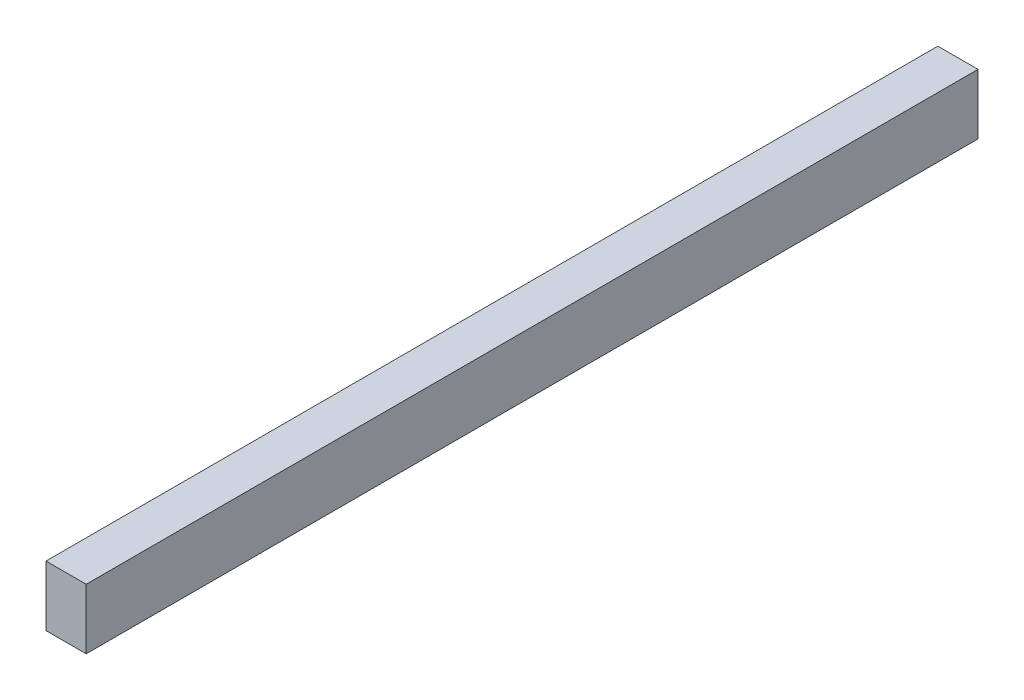
ISO-10303-21;
HEADER;
FILE_DESCRIPTION(('STEP AP214'),'2;1');
FILE_NAME('part.step','',(''),(''),'','','');
FILE_SCHEMA(('AUTOMOTIVE_DESIGN { 1 0 10303 214 1 1 1 1 }'));
ENDSEC;
DATA;
#1=APPLICATION_CONTEXT('core data for automotive mechanical design processes');
#2=APPLICATION_PROTOCOL_DEFINITION('international standard','automotive_design',2000,#1);
#3=PRODUCT_CONTEXT('',#1,'mechanical');
#4=PRODUCT('Part','Part','',(#3));
#5=PRODUCT_RELATED_PRODUCT_CATEGORY('part','',(#4));
#6=PRODUCT_DEFINITION_FORMATION('','',#4);
#7=PRODUCT_DEFINITION_CONTEXT('part definition',#1,'design');
#8=PRODUCT_DEFINITION('design','',#6,#7);
#9=PRODUCT_DEFINITION_SHAPE('','',#8);
#10=(LENGTH_UNIT() NAMED_UNIT(*) SI_UNIT(.MILLI.,.METRE.));
#11=(NAMED_UNIT(*) PLANE_ANGLE_UNIT() SI_UNIT($,.RADIAN.));
#12=(NAMED_UNIT(*) SI_UNIT($,.STERADIAN.) SOLID_ANGLE_UNIT());
#13=UNCERTAINTY_MEASURE_WITH_UNIT(LENGTH_MEASURE(1.E-05),#10,'distance_accuracy_value','');
#14=(GEOMETRIC_REPRESENTATION_CONTEXT(3) GLOBAL_UNCERTAINTY_ASSIGNED_CONTEXT((#13)) GLOBAL_UNIT_ASSIGNED_CONTEXT((#10,
#11,#12)) REPRESENTATION_CONTEXT('',''));
#15=CARTESIAN_POINT('',(0.,0.,0.));
#16=DIRECTION('',(0.,0.,1.));
#17=DIRECTION('',(1.,0.,0.));
#18=AXIS2_PLACEMENT_3D('',#15,#16,#17);
#19=CARTESIAN_POINT('',(0.,0.,2220.));
#20=DIRECTION('',(1.,0.,0.));
#21=DIRECTION('',(0.,0.,-1.));
#22=AXIS2_PLACEMENT_3D('',#19,#20,#21);
#23=PLANE('',#22);
#24=DIRECTION('',(0.,1.,0.));
#25=VECTOR('',#24,1.);
#26=CARTESIAN_POINT('',(0.,0.,2120.));
#27=LINE('',#26,#25);
#28=CARTESIAN_POINT('',(0.,0.,2120.));
#29=VERTEX_POINT('',#28);
#30=CARTESIAN_POINT('',(0.,150.,2120.));
#31=VERTEX_POINT('',#30);
#32=EDGE_CURVE('E12',#29,#31,#27,.T.);
#33=ORIENTED_EDGE('',*,*,#32,.F.);
#34=DIRECTION('',(0.,0.,-1.));
#35=VECTOR('',#34,1.);
#36=CARTESIAN_POINT('',(0.,0.,2220.));
#37=LINE('',#36,#35);
#38=CARTESIAN_POINT('',(0.,0.,2220.));
#39=VERTEX_POINT('',#38);
#40=EDGE_CURVE('E105',#39,#29,#37,.T.);
#41=ORIENTED_EDGE('',*,*,#40,.F.);
#42=DIRECTION('',(0.,-1.,0.));
#43=VECTOR('',#42,1.);
#44=CARTESIAN_POINT('',(0.,0.,2220.));
#45=LINE('',#44,#43);
#46=CARTESIAN_POINT('',(0.,150.,2220.));
#47=VERTEX_POINT('',#46);
#48=EDGE_CURVE('E112',#47,#39,#45,.T.);
#49=ORIENTED_EDGE('',*,*,#48,.F.);
#50=DIRECTION('',(0.,0.,-1.));
#51=VECTOR('',#50,1.);
#52=CARTESIAN_POINT('',(0.,150.,2220.));
#53=LINE('',#52,#51);
#54=EDGE_CURVE('E139',#47,#31,#53,.T.);
#55=ORIENTED_EDGE('',*,*,#54,.T.);
#56=EDGE_LOOP('',(#33,#41,#49,#55));
#57=FACE_BOUND('',#56,.T.);
#58=ADVANCED_FACE('F51',(#57),#23,.F.);
#59=CARTESIAN_POINT('',(0.,0.,100.));
#60=VERTEX_POINT('',#59);
#61=EDGE_CURVE('E123',#29,#60,#37,.T.);
#62=ORIENTED_EDGE('',*,*,#61,.F.);
#63=ORIENTED_EDGE('',*,*,#32,.T.);
#64=CARTESIAN_POINT('',(0.,150.,100.));
#65=VERTEX_POINT('',#64);
#66=EDGE_CURVE('E145',#31,#65,#53,.T.);
#67=ORIENTED_EDGE('',*,*,#66,.T.);
#68=DIRECTION('',(0.,1.,0.));
#69=VECTOR('',#68,1.);
#70=CARTESIAN_POINT('',(0.,0.,100.));
#71=LINE('',#70,#69);
#72=EDGE_CURVE('E60',#60,#65,#71,.T.);
#73=ORIENTED_EDGE('',*,*,#72,.F.);
#74=EDGE_LOOP('',(#62,#63,#67,#73));
#75=FACE_BOUND('',#74,.T.);
#76=ADVANCED_FACE('F191',(#75),#23,.F.);
#77=CARTESIAN_POINT('',(0.,0.,0.));
#78=VERTEX_POINT('',#77);
#79=EDGE_CURVE('E124',#60,#78,#37,.T.);
#80=ORIENTED_EDGE('',*,*,#79,.F.);
#81=ORIENTED_EDGE('',*,*,#72,.T.);
#82=CARTESIAN_POINT('',(0.,150.,0.));
#83=VERTEX_POINT('',#82);
#84=EDGE_CURVE('E146',#65,#83,#53,.T.);
#85=ORIENTED_EDGE('',*,*,#84,.T.);
#86=DIRECTION('',(0.,-1.,0.));
#87=VECTOR('',#86,1.);
#88=CARTESIAN_POINT('',(0.,0.,0.));
#89=LINE('',#88,#87);
#90=EDGE_CURVE('E163',#83,#78,#89,.T.);
#91=ORIENTED_EDGE('',*,*,#90,.T.);
#92=EDGE_LOOP('',(#80,#81,#85,#91));
#93=FACE_BOUND('',#92,.T.);
#94=ADVANCED_FACE('F53',(#93),#23,.F.);
#95=CARTESIAN_POINT('',(0.,0.,2220.));
#96=DIRECTION('',(0.,1.,0.));
#97=DIRECTION('',(0.,0.,1.));
#98=AXIS2_PLACEMENT_3D('',#95,#96,#97);
#99=PLANE('',#98);
#100=DIRECTION('',(1.,0.,0.));
#101=VECTOR('',#100,1.);
#102=CARTESIAN_POINT('',(0.,0.,0.));
#103=LINE('',#102,#101);
#104=CARTESIAN_POINT('',(100.,0.,0.));
#105=VERTEX_POINT('',#104);
#106=EDGE_CURVE('E160',#78,#105,#103,.T.);
#107=ORIENTED_EDGE('',*,*,#106,.T.);
#108=DIRECTION('',(0.,0.,-1.));
#109=VECTOR('',#108,1.);
#110=CARTESIAN_POINT('',(100.,0.,2220.));
#111=LINE('',#110,#109);
#112=CARTESIAN_POINT('',(100.,0.,2220.));
#113=VERTEX_POINT('',#112);
#114=EDGE_CURVE('E107',#113,#105,#111,.T.);
#115=ORIENTED_EDGE('',*,*,#114,.F.);
#116=DIRECTION('',(1.,0.,0.));
#117=VECTOR('',#116,1.);
#118=CARTESIAN_POINT('',(0.,0.,2220.));
#119=LINE('',#118,#117);
#120=EDGE_CURVE('E102',#39,#113,#119,.T.);
#121=ORIENTED_EDGE('',*,*,#120,.F.);
#122=ORIENTED_EDGE('',*,*,#40,.T.);
#123=ORIENTED_EDGE('',*,*,#61,.T.);
#124=ORIENTED_EDGE('',*,*,#79,.T.);
#125=EDGE_LOOP('',(#107,#115,#121,#122,#123,#124));
#126=FACE_BOUND('',#125,.T.);
#127=ADVANCED_FACE('F104',(#126),#99,.F.);
#128=CARTESIAN_POINT('',(100.,0.,2220.));
#129=DIRECTION('',(-1.,0.,0.));
#130=DIRECTION('',(0.,0.,1.));
#131=AXIS2_PLACEMENT_3D('',#128,#129,#130);
#132=PLANE('',#131);
#133=DIRECTION('',(0.,1.,0.));
#134=VECTOR('',#133,1.);
#135=CARTESIAN_POINT('',(100.,0.,0.));
#136=LINE('',#135,#134);
#137=CARTESIAN_POINT('',(100.,150.,0.));
#138=VERTEX_POINT('',#137);
#139=EDGE_CURVE('E157',#105,#138,#136,.T.);
#140=ORIENTED_EDGE('',*,*,#139,.T.);
#141=DIRECTION('',(0.,0.,-1.));
#142=VECTOR('',#141,1.);
#143=CARTESIAN_POINT('',(100.,150.,2220.));
#144=LINE('',#143,#142);
#145=CARTESIAN_POINT('',(100.,150.,2220.));
#146=VERTEX_POINT('',#145);
#147=EDGE_CURVE('E134',#146,#138,#144,.T.);
#148=ORIENTED_EDGE('',*,*,#147,.F.);
#149=DIRECTION('',(0.,1.,0.));
#150=VECTOR('',#149,1.);
#151=CARTESIAN_POINT('',(100.,0.,2220.));
#152=LINE('',#151,#150);
#153=EDGE_CURVE('E111',#113,#146,#152,.T.);
#154=ORIENTED_EDGE('',*,*,#153,.F.);
#155=ORIENTED_EDGE('',*,*,#114,.T.);
#156=EDGE_LOOP('',(#140,#148,#154,#155));
#157=FACE_BOUND('',#156,.T.);
#158=ADVANCED_FACE('F171',(#157),#132,.F.);
#159=CARTESIAN_POINT('',(0.,150.,2220.));
#160=DIRECTION('',(0.,-1.,0.));
#161=DIRECTION('',(0.,0.,-1.));
#162=AXIS2_PLACEMENT_3D('',#159,#160,#161);
#163=PLANE('',#162);
#164=DIRECTION('',(-1.,0.,0.));
#165=VECTOR('',#164,1.);
#166=CARTESIAN_POINT('',(0.,150.,0.));
#167=LINE('',#166,#165);
#168=EDGE_CURVE('E120',#138,#83,#167,.T.);
#169=ORIENTED_EDGE('',*,*,#168,.T.);
#170=ORIENTED_EDGE('',*,*,#84,.F.);
#171=ORIENTED_EDGE('',*,*,#66,.F.);
#172=ORIENTED_EDGE('',*,*,#54,.F.);
#173=DIRECTION('',(-1.,0.,0.));
#174=VECTOR('',#173,1.);
#175=CARTESIAN_POINT('',(0.,150.,2220.));
#176=LINE('',#175,#174);
#177=EDGE_CURVE('E117',#146,#47,#176,.T.);
#178=ORIENTED_EDGE('',*,*,#177,.F.);
#179=ORIENTED_EDGE('',*,*,#147,.T.);
#180=EDGE_LOOP('',(#169,#170,#171,#172,#178,#179));
#181=FACE_BOUND('',#180,.T.);
#182=ADVANCED_FACE('F174',(#181),#163,.F.);
#183=CARTESIAN_POINT('',(0.,0.,2220.));
#184=DIRECTION('',(0.,0.,-1.));
#185=DIRECTION('',(-1.,0.,0.));
#186=AXIS2_PLACEMENT_3D('',#183,#184,#185);
#187=PLANE('',#186);
#188=ORIENTED_EDGE('',*,*,#48,.T.);
#189=ORIENTED_EDGE('',*,*,#120,.T.);
#190=ORIENTED_EDGE('',*,*,#153,.T.);
#191=ORIENTED_EDGE('',*,*,#177,.T.);
#192=EDGE_LOOP('',(#188,#189,#190,#191));
#193=FACE_BOUND('',#192,.T.);
#194=ADVANCED_FACE('F115',(#193),#187,.F.);
#195=CARTESIAN_POINT('',(0.,0.,0.));
#196=DIRECTION('',(0.,0.,-1.));
#197=DIRECTION('',(-1.,0.,0.));
#198=AXIS2_PLACEMENT_3D('',#195,#196,#197);
#199=PLANE('',#198);
#200=ORIENTED_EDGE('',*,*,#90,.F.);
#201=ORIENTED_EDGE('',*,*,#168,.F.);
#202=ORIENTED_EDGE('',*,*,#139,.F.);
#203=ORIENTED_EDGE('',*,*,#106,.F.);
#204=EDGE_LOOP('',(#200,#201,#202,#203));
#205=FACE_BOUND('',#204,.T.);
#206=ADVANCED_FACE('F182',(#205),#199,.T.);
#207=CLOSED_SHELL('',(#58,#76,#94,#127,#158,#182,#194,#206));
#208=MANIFOLD_SOLID_BREP('B2',#207);
#209=ADVANCED_BREP_SHAPE_REPRESENTATION('',(#18,#208),#14);
#210=SHAPE_DEFINITION_REPRESENTATION(#9,#209);
ENDSEC;
END-ISO-10303-21;
